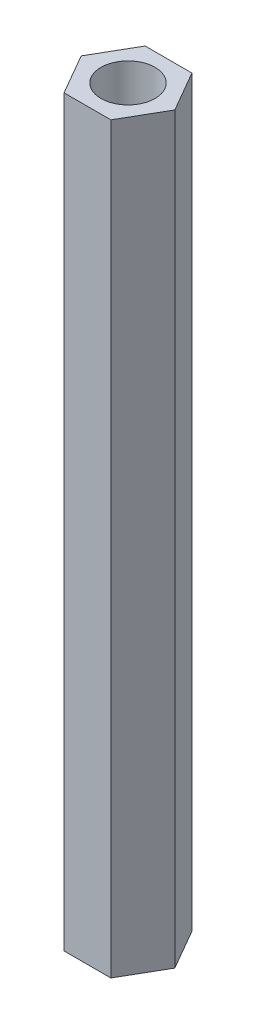
ISO-10303-21;
HEADER;
FILE_DESCRIPTION(('STEP AP214'),'2;1');
FILE_NAME('part.step','',(''),(''),'','','');
FILE_SCHEMA(('AUTOMOTIVE_DESIGN { 1 0 10303 214 1 1 1 1 }'));
ENDSEC;
DATA;
#1=APPLICATION_CONTEXT('core data for automotive mechanical design processes');
#2=APPLICATION_PROTOCOL_DEFINITION('international standard','automotive_design',2000,#1);
#3=PRODUCT_CONTEXT('',#1,'mechanical');
#4=PRODUCT('Part','Part','',(#3));
#5=PRODUCT_RELATED_PRODUCT_CATEGORY('part','',(#4));
#6=PRODUCT_DEFINITION_FORMATION('','',#4);
#7=PRODUCT_DEFINITION_CONTEXT('part definition',#1,'design');
#8=PRODUCT_DEFINITION('design','',#6,#7);
#9=PRODUCT_DEFINITION_SHAPE('','',#8);
#10=(LENGTH_UNIT() NAMED_UNIT(*) SI_UNIT(.MILLI.,.METRE.));
#11=(NAMED_UNIT(*) PLANE_ANGLE_UNIT() SI_UNIT($,.RADIAN.));
#12=(NAMED_UNIT(*) SI_UNIT($,.STERADIAN.) SOLID_ANGLE_UNIT());
#13=UNCERTAINTY_MEASURE_WITH_UNIT(LENGTH_MEASURE(1.E-05),#10,'distance_accuracy_value','');
#14=(GEOMETRIC_REPRESENTATION_CONTEXT(3) GLOBAL_UNCERTAINTY_ASSIGNED_CONTEXT((#13)) GLOBAL_UNIT_ASSIGNED_CONTEXT((#10,
#11,#12)) REPRESENTATION_CONTEXT('',''));
#15=CARTESIAN_POINT('',(0.,0.,0.));
#16=DIRECTION('',(0.,0.,1.));
#17=DIRECTION('',(1.,0.,0.));
#18=AXIS2_PLACEMENT_3D('',#15,#16,#17);
#19=CARTESIAN_POINT('',(0.,55.,0.));
#20=DIRECTION('',(0.,1.,0.));
#21=DIRECTION('',(0.,0.,1.));
#22=AXIS2_PLACEMENT_3D('',#19,#20,#21);
#23=PLANE('',#22);
#24=DIRECTION('',(-0.5,0.,-0.866025403784439));
#25=VECTOR('',#24,1.);
#26=CARTESIAN_POINT('',(3.46410161513776,55.,0.));
#27=LINE('',#26,#25);
#28=CARTESIAN_POINT('',(3.46410161513776,55.,0.));
#29=VERTEX_POINT('',#28);
#30=CARTESIAN_POINT('',(1.73205080756888,55.,-3.));
#31=VERTEX_POINT('',#30);
#32=EDGE_CURVE('E134',#29,#31,#27,.T.);
#33=ORIENTED_EDGE('',*,*,#32,.T.);
#34=DIRECTION('',(-1.,0.,0.));
#35=VECTOR('',#34,1.);
#36=CARTESIAN_POINT('',(1.73205080756888,55.,-3.));
#37=LINE('',#36,#35);
#38=CARTESIAN_POINT('',(-1.73205080756888,55.,-3.));
#39=VERTEX_POINT('',#38);
#40=EDGE_CURVE('E93',#31,#39,#37,.T.);
#41=ORIENTED_EDGE('',*,*,#40,.T.);
#42=DIRECTION('',(-0.5,0.,0.866025403784439));
#43=VECTOR('',#42,1.);
#44=CARTESIAN_POINT('',(-1.73205080756888,55.,-3.));
#45=LINE('',#44,#43);
#46=CARTESIAN_POINT('',(-3.46410161513775,55.,0.));
#47=VERTEX_POINT('',#46);
#48=EDGE_CURVE('E102',#39,#47,#45,.T.);
#49=ORIENTED_EDGE('',*,*,#48,.T.);
#50=DIRECTION('',(0.5,0.,0.866025403784438));
#51=VECTOR('',#50,1.);
#52=CARTESIAN_POINT('',(-3.46410161513775,55.,0.));
#53=LINE('',#52,#51);
#54=CARTESIAN_POINT('',(-1.73205080756888,55.,3.));
#55=VERTEX_POINT('',#54);
#56=EDGE_CURVE('E98',#47,#55,#53,.T.);
#57=ORIENTED_EDGE('',*,*,#56,.T.);
#58=DIRECTION('',(1.,0.,0.));
#59=VECTOR('',#58,1.);
#60=CARTESIAN_POINT('',(-1.73205080756888,55.,3.));
#61=LINE('',#60,#59);
#62=CARTESIAN_POINT('',(1.73205080756888,55.,3.));
#63=VERTEX_POINT('',#62);
#64=EDGE_CURVE('E105',#55,#63,#61,.T.);
#65=ORIENTED_EDGE('',*,*,#64,.T.);
#66=DIRECTION('',(0.5,0.,-0.866025403784439));
#67=VECTOR('',#66,1.);
#68=CARTESIAN_POINT('',(1.73205080756888,55.,3.));
#69=LINE('',#68,#67);
#70=EDGE_CURVE('E53',#63,#29,#69,.T.);
#71=ORIENTED_EDGE('',*,*,#70,.T.);
#72=EDGE_LOOP('',(#33,#41,#49,#57,#65,#71));
#73=FACE_BOUND('',#72,.T.);
#74=CARTESIAN_POINT('',(0.,55.,0.));
#75=DIRECTION('',(0.,1.,0.));
#76=DIRECTION('',(0.,0.,1.));
#77=AXIS2_PLACEMENT_3D('',#74,#75,#76);
#78=CIRCLE('',#77,2.);
#79=CARTESIAN_POINT('',(0.,55.,2.));
#80=VERTEX_POINT('',#79);
#81=EDGE_CURVE('E127',#80,#80,#78,.T.);
#82=ORIENTED_EDGE('',*,*,#81,.F.);
#83=EDGE_LOOP('',(#82));
#84=FACE_BOUND('',#83,.T.);
#85=ADVANCED_FACE('F40',(#73,#84),#23,.T.);
#86=CARTESIAN_POINT('',(0.,0.,0.));
#87=DIRECTION('',(0.,1.,0.));
#88=DIRECTION('',(0.,0.,1.));
#89=AXIS2_PLACEMENT_3D('',#86,#87,#88);
#90=PLANE('',#89);
#91=DIRECTION('',(-0.5,0.,-0.866025403784439));
#92=VECTOR('',#91,1.);
#93=CARTESIAN_POINT('',(3.46410161513776,0.,0.));
#94=LINE('',#93,#92);
#95=CARTESIAN_POINT('',(3.46410161513776,0.,0.));
#96=VERTEX_POINT('',#95);
#97=CARTESIAN_POINT('',(1.73205080756888,0.,-3.));
#98=VERTEX_POINT('',#97);
#99=EDGE_CURVE('E122',#96,#98,#94,.T.);
#100=ORIENTED_EDGE('',*,*,#99,.F.);
#101=DIRECTION('',(0.5,0.,-0.866025403784439));
#102=VECTOR('',#101,1.);
#103=CARTESIAN_POINT('',(1.73205080756888,0.,3.));
#104=LINE('',#103,#102);
#105=CARTESIAN_POINT('',(1.73205080756888,0.,3.));
#106=VERTEX_POINT('',#105);
#107=EDGE_CURVE('E84',#106,#96,#104,.T.);
#108=ORIENTED_EDGE('',*,*,#107,.F.);
#109=DIRECTION('',(1.,0.,0.));
#110=VECTOR('',#109,1.);
#111=CARTESIAN_POINT('',(-1.73205080756888,0.,3.));
#112=LINE('',#111,#110);
#113=CARTESIAN_POINT('',(-1.73205080756888,0.,3.));
#114=VERTEX_POINT('',#113);
#115=EDGE_CURVE('E80',#114,#106,#112,.T.);
#116=ORIENTED_EDGE('',*,*,#115,.F.);
#117=DIRECTION('',(0.5,0.,0.866025403784438));
#118=VECTOR('',#117,1.);
#119=CARTESIAN_POINT('',(-3.46410161513775,0.,0.));
#120=LINE('',#119,#118);
#121=CARTESIAN_POINT('',(-3.46410161513775,0.,0.));
#122=VERTEX_POINT('',#121);
#123=EDGE_CURVE('E115',#122,#114,#120,.T.);
#124=ORIENTED_EDGE('',*,*,#123,.F.);
#125=DIRECTION('',(-0.5,0.,0.866025403784439));
#126=VECTOR('',#125,1.);
#127=CARTESIAN_POINT('',(-1.73205080756888,0.,-3.));
#128=LINE('',#127,#126);
#129=CARTESIAN_POINT('',(-1.73205080756888,0.,-3.));
#130=VERTEX_POINT('',#129);
#131=EDGE_CURVE('E126',#130,#122,#128,.T.);
#132=ORIENTED_EDGE('',*,*,#131,.F.);
#133=DIRECTION('',(-1.,0.,0.));
#134=VECTOR('',#133,1.);
#135=CARTESIAN_POINT('',(1.73205080756888,0.,-3.));
#136=LINE('',#135,#134);
#137=EDGE_CURVE('E125',#98,#130,#136,.T.);
#138=ORIENTED_EDGE('',*,*,#137,.F.);
#139=EDGE_LOOP('',(#100,#108,#116,#124,#132,#138));
#140=FACE_BOUND('',#139,.T.);
#141=CARTESIAN_POINT('',(0.,0.,0.));
#142=DIRECTION('',(0.,1.,0.));
#143=DIRECTION('',(0.,0.,1.));
#144=AXIS2_PLACEMENT_3D('',#141,#142,#143);
#145=CIRCLE('',#144,2.);
#146=CARTESIAN_POINT('',(0.,0.,2.));
#147=VERTEX_POINT('',#146);
#148=EDGE_CURVE('E208',#147,#147,#145,.T.);
#149=ORIENTED_EDGE('',*,*,#148,.T.);
#150=EDGE_LOOP('',(#149));
#151=FACE_BOUND('',#150,.T.);
#152=ADVANCED_FACE('F142',(#140,#151),#90,.F.);
#153=CARTESIAN_POINT('',(3.46410161513776,55.,0.));
#154=DIRECTION('',(-0.866025403784439,0.,0.5));
#155=DIRECTION('',(0.5,0.,0.866025403784438));
#156=AXIS2_PLACEMENT_3D('',#153,#154,#155);
#157=PLANE('',#156);
#158=ORIENTED_EDGE('',*,*,#99,.T.);
#159=DIRECTION('',(0.,-1.,0.));
#160=VECTOR('',#159,1.);
#161=CARTESIAN_POINT('',(1.73205080756888,55.,-3.));
#162=LINE('',#161,#160);
#163=EDGE_CURVE('E11',#31,#98,#162,.T.);
#164=ORIENTED_EDGE('',*,*,#163,.F.);
#165=ORIENTED_EDGE('',*,*,#32,.F.);
#166=DIRECTION('',(0.,-1.,0.));
#167=VECTOR('',#166,1.);
#168=CARTESIAN_POINT('',(3.46410161513776,55.,0.));
#169=LINE('',#168,#167);
#170=EDGE_CURVE('E119',#29,#96,#169,.T.);
#171=ORIENTED_EDGE('',*,*,#170,.T.);
#172=EDGE_LOOP('',(#158,#164,#165,#171));
#173=FACE_BOUND('',#172,.T.);
#174=ADVANCED_FACE('F39',(#173),#157,.F.);
#175=CARTESIAN_POINT('',(1.73205080756888,55.,-3.));
#176=DIRECTION('',(0.,0.,1.));
#177=DIRECTION('',(1.,0.,0.));
#178=AXIS2_PLACEMENT_3D('',#175,#176,#177);
#179=PLANE('',#178);
#180=ORIENTED_EDGE('',*,*,#137,.T.);
#181=DIRECTION('',(0.,-1.,0.));
#182=VECTOR('',#181,1.);
#183=CARTESIAN_POINT('',(-1.73205080756888,55.,-3.));
#184=LINE('',#183,#182);
#185=EDGE_CURVE('E46',#39,#130,#184,.T.);
#186=ORIENTED_EDGE('',*,*,#185,.F.);
#187=ORIENTED_EDGE('',*,*,#40,.F.);
#188=ORIENTED_EDGE('',*,*,#163,.T.);
#189=EDGE_LOOP('',(#180,#186,#187,#188));
#190=FACE_BOUND('',#189,.T.);
#191=ADVANCED_FACE('F170',(#190),#179,.F.);
#192=CARTESIAN_POINT('',(-1.73205080756888,55.,-3.));
#193=DIRECTION('',(0.866025403784439,0.,0.5));
#194=DIRECTION('',(0.5,0.,-0.866025403784439));
#195=AXIS2_PLACEMENT_3D('',#192,#193,#194);
#196=PLANE('',#195);
#197=ORIENTED_EDGE('',*,*,#131,.T.);
#198=DIRECTION('',(0.,-1.,0.));
#199=VECTOR('',#198,1.);
#200=CARTESIAN_POINT('',(-3.46410161513775,55.,0.));
#201=LINE('',#200,#199);
#202=EDGE_CURVE('E114',#47,#122,#201,.T.);
#203=ORIENTED_EDGE('',*,*,#202,.F.);
#204=ORIENTED_EDGE('',*,*,#48,.F.);
#205=ORIENTED_EDGE('',*,*,#185,.T.);
#206=EDGE_LOOP('',(#197,#203,#204,#205));
#207=FACE_BOUND('',#206,.T.);
#208=ADVANCED_FACE('F138',(#207),#196,.F.);
#209=CARTESIAN_POINT('',(-3.46410161513775,55.,0.));
#210=DIRECTION('',(0.866025403784439,0.,-0.5));
#211=DIRECTION('',(-0.5,0.,-0.866025403784439));
#212=AXIS2_PLACEMENT_3D('',#209,#210,#211);
#213=PLANE('',#212);
#214=ORIENTED_EDGE('',*,*,#123,.T.);
#215=DIRECTION('',(0.,-1.,0.));
#216=VECTOR('',#215,1.);
#217=CARTESIAN_POINT('',(-1.73205080756888,55.,3.));
#218=LINE('',#217,#216);
#219=EDGE_CURVE('E108',#55,#114,#218,.T.);
#220=ORIENTED_EDGE('',*,*,#219,.F.);
#221=ORIENTED_EDGE('',*,*,#56,.F.);
#222=ORIENTED_EDGE('',*,*,#202,.T.);
#223=EDGE_LOOP('',(#214,#220,#221,#222));
#224=FACE_BOUND('',#223,.T.);
#225=ADVANCED_FACE('F109',(#224),#213,.F.);
#226=CARTESIAN_POINT('',(-1.73205080756888,55.,3.));
#227=DIRECTION('',(0.,0.,-1.));
#228=DIRECTION('',(-1.,0.,0.));
#229=AXIS2_PLACEMENT_3D('',#226,#227,#228);
#230=PLANE('',#229);
#231=ORIENTED_EDGE('',*,*,#115,.T.);
#232=DIRECTION('',(0.,-1.,0.));
#233=VECTOR('',#232,1.);
#234=CARTESIAN_POINT('',(1.73205080756888,55.,3.));
#235=LINE('',#234,#233);
#236=EDGE_CURVE('E111',#63,#106,#235,.T.);
#237=ORIENTED_EDGE('',*,*,#236,.F.);
#238=ORIENTED_EDGE('',*,*,#64,.F.);
#239=ORIENTED_EDGE('',*,*,#219,.T.);
#240=EDGE_LOOP('',(#231,#237,#238,#239));
#241=FACE_BOUND('',#240,.T.);
#242=ADVANCED_FACE('F117',(#241),#230,.F.);
#243=CARTESIAN_POINT('',(1.73205080756888,55.,3.));
#244=DIRECTION('',(-0.866025403784439,0.,-0.5));
#245=DIRECTION('',(-0.5,0.,0.866025403784439));
#246=AXIS2_PLACEMENT_3D('',#243,#244,#245);
#247=PLANE('',#246);
#248=ORIENTED_EDGE('',*,*,#107,.T.);
#249=ORIENTED_EDGE('',*,*,#170,.F.);
#250=ORIENTED_EDGE('',*,*,#70,.F.);
#251=ORIENTED_EDGE('',*,*,#236,.T.);
#252=EDGE_LOOP('',(#248,#249,#250,#251));
#253=FACE_BOUND('',#252,.T.);
#254=ADVANCED_FACE('F150',(#253),#247,.F.);
#255=CARTESIAN_POINT('',(0.,55.,0.));
#256=DIRECTION('',(0.,-1.,0.));
#257=DIRECTION('',(0.,0.,-1.));
#258=AXIS2_PLACEMENT_3D('',#255,#256,#257);
#259=CYLINDRICAL_SURFACE('',#258,2.);
#260=ORIENTED_EDGE('',*,*,#81,.T.);
#261=EDGE_LOOP('',(#260));
#262=FACE_BOUND('',#261,.T.);
#263=ORIENTED_EDGE('',*,*,#148,.F.);
#264=EDGE_LOOP('',(#263));
#265=FACE_BOUND('',#264,.T.);
#266=ADVANCED_FACE('F149',(#262,#265),#259,.F.);
#267=CLOSED_SHELL('',(#85,#152,#174,#191,#208,#225,#242,#254,#266));
#268=MANIFOLD_SOLID_BREP('B2',#267);
#269=ADVANCED_BREP_SHAPE_REPRESENTATION('',(#18,#268),#14);
#270=SHAPE_DEFINITION_REPRESENTATION(#9,#269);
ENDSEC;
END-ISO-10303-21;
